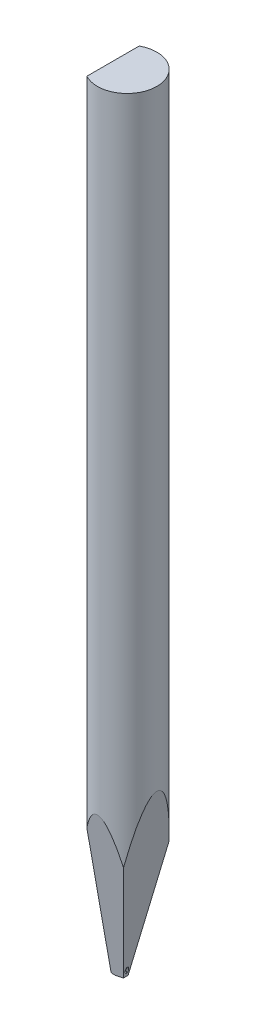
ISO-10303-21;
HEADER;
FILE_DESCRIPTION(('STEP AP214'),'2;1');
FILE_NAME('part.step','',(''),(''),'','','');
FILE_SCHEMA(('AUTOMOTIVE_DESIGN { 1 0 10303 214 1 1 1 1 }'));
ENDSEC;
DATA;
#1=APPLICATION_CONTEXT('core data for automotive mechanical design processes');
#2=APPLICATION_PROTOCOL_DEFINITION('international standard','automotive_design',2000,#1);
#3=PRODUCT_CONTEXT('',#1,'mechanical');
#4=PRODUCT('Part','Part','',(#3));
#5=PRODUCT_RELATED_PRODUCT_CATEGORY('part','',(#4));
#6=PRODUCT_DEFINITION_FORMATION('','',#4);
#7=PRODUCT_DEFINITION_CONTEXT('part definition',#1,'design');
#8=PRODUCT_DEFINITION('design','',#6,#7);
#9=PRODUCT_DEFINITION_SHAPE('','',#8);
#10=(LENGTH_UNIT() NAMED_UNIT(*) SI_UNIT(.MILLI.,.METRE.));
#11=(NAMED_UNIT(*) PLANE_ANGLE_UNIT() SI_UNIT($,.RADIAN.));
#12=(NAMED_UNIT(*) SI_UNIT($,.STERADIAN.) SOLID_ANGLE_UNIT());
#13=UNCERTAINTY_MEASURE_WITH_UNIT(LENGTH_MEASURE(1.E-05),#10,'distance_accuracy_value','');
#14=(GEOMETRIC_REPRESENTATION_CONTEXT(3) GLOBAL_UNCERTAINTY_ASSIGNED_CONTEXT((#13)) GLOBAL_UNIT_ASSIGNED_CONTEXT((#10,
#11,#12)) REPRESENTATION_CONTEXT('',''));
#15=CARTESIAN_POINT('',(0.,0.,0.));
#16=DIRECTION('',(0.,0.,1.));
#17=DIRECTION('',(1.,0.,0.));
#18=AXIS2_PLACEMENT_3D('',#15,#16,#17);
#19=CARTESIAN_POINT('',(26.8738719491216,0.,0.0508));
#20=DIRECTION('',(0.,-0.173648177666931,0.984807753012208));
#21=DIRECTION('',(0.,-0.984807753012208,-0.173648177666931));
#22=AXIS2_PLACEMENT_3D('',#19,#20,#21);
#23=PLANE('',#22);
#24=CARTESIAN_POINT('',(-0.35052,0.0254,0.0552787053099968));
#25=DIRECTION('',(0.,-0.173648177666931,0.984807753012208));
#26=DIRECTION('',(0.,-0.984807753012208,-0.173648177666931));
#27=AXIS2_PLACEMENT_3D('',#24,#25,#26);
#28=ELLIPSE('',#27,0.0257918359418979,0.0254);
#29=CARTESIAN_POINT('',(-0.35052,0.,0.0508000000000018));
#30=VERTEX_POINT('',#29);
#31=CARTESIAN_POINT('',(-0.37592,0.0254,0.0552787053099968));
#32=VERTEX_POINT('',#31);
#33=EDGE_CURVE('E168',#30,#32,#28,.F.);
#34=ORIENTED_EDGE('',*,*,#33,.F.);
#35=DIRECTION('',(-1.,0.,0.));
#36=VECTOR('',#35,1.);
#37=CARTESIAN_POINT('',(26.8738719491216,0.,0.0508));
#38=LINE('',#37,#36);
#39=CARTESIAN_POINT('',(-0.248920000000003,0.,0.0508));
#40=VERTEX_POINT('',#39);
#41=EDGE_CURVE('E156',#40,#30,#38,.T.);
#42=ORIENTED_EDGE('',*,*,#41,.F.);
#43=DIRECTION('',(-0.964921520309631,-0.258549942126377,-0.0455893306574928));
#44=VECTOR('',#43,1.);
#45=CARTESIAN_POINT('',(25.0043939244254,6.76660507225945,1.2439350420381));
#46=LINE('',#45,#44);
#47=CARTESIAN_POINT('',(-0.0356433899412251,0.0571472954296968,0.0608766100587731));
#48=VERTEX_POINT('',#47);
#49=EDGE_CURVE('E279',#48,#40,#46,.T.);
#50=ORIENTED_EDGE('',*,*,#49,.F.);
#51=DIRECTION('',(-0.171087869746036,-0.970287525247814,-0.171087869746036));
#52=VECTOR('',#51,1.);
#53=CARTESIAN_POINT('',(0.742244968889041,4.46877140255603,0.838764968889042));
#54=LINE('',#53,#52);
#55=CARTESIAN_POINT('',(0.510025990868478,3.15179213433781,0.606545990868478));
#56=VERTEX_POINT('',#55);
#57=EDGE_CURVE('E276',#56,#48,#54,.T.);
#58=ORIENTED_EDGE('',*,*,#57,.F.);
#59=CARTESIAN_POINT('',(0.,-0.288101116436578,0.));
#60=DIRECTION('',(0.,-0.173648177666931,0.984807753012208));
#61=DIRECTION('',(0.,-0.984807753012208,-0.173648177666931));
#62=AXIS2_PLACEMENT_3D('',#59,#60,#61);
#63=ELLIPSE('',#62,4.56371043248163,0.792479999999998);
#64=CARTESIAN_POINT('',(-0.37592,3.66844093071414,0.69764511322018));
#65=VERTEX_POINT('',#64);
#66=EDGE_CURVE('E155',#56,#65,#63,.T.);
#67=ORIENTED_EDGE('',*,*,#66,.T.);
#68=DIRECTION('',(0.,0.984807753012208,0.173648177666931));
#69=VECTOR('',#68,1.);
#70=CARTESIAN_POINT('',(-0.37592,20.2093857917021,3.6142599786234));
#71=LINE('',#70,#69);
#72=EDGE_CURVE('E297',#32,#65,#71,.T.);
#73=ORIENTED_EDGE('',*,*,#72,.F.);
#74=EDGE_LOOP('',(#34,#42,#50,#58,#67,#73));
#75=FACE_BOUND('',#74,.T.);
#76=ADVANCED_FACE('F43',(#75),#23,.T.);
#77=CARTESIAN_POINT('',(26.8738719491216,0.,-0.0508));
#78=DIRECTION('',(0.,-0.173648177666931,-0.984807753012208));
#79=DIRECTION('',(0.,0.984807753012208,-0.173648177666931));
#80=AXIS2_PLACEMENT_3D('',#77,#78,#79);
#81=PLANE('',#80);
#82=CARTESIAN_POINT('',(-0.35052,0.0254,-0.0552787053099968));
#83=DIRECTION('',(0.,-0.173648177666931,-0.984807753012208));
#84=DIRECTION('',(0.,0.984807753012208,-0.173648177666931));
#85=AXIS2_PLACEMENT_3D('',#82,#83,#84);
#86=ELLIPSE('',#85,0.0257918359418979,0.0254);
#87=CARTESIAN_POINT('',(-0.37592,0.0254,-0.0552787053099968));
#88=VERTEX_POINT('',#87);
#89=CARTESIAN_POINT('',(-0.35052,0.,-0.0508000000000002));
#90=VERTEX_POINT('',#89);
#91=EDGE_CURVE('E11',#88,#90,#86,.F.);
#92=ORIENTED_EDGE('',*,*,#91,.F.);
#93=DIRECTION('',(0.,-0.984807753012208,0.173648177666931));
#94=VECTOR('',#93,1.);
#95=CARTESIAN_POINT('',(-0.37592,20.5673030312895,-3.67737044482337));
#96=LINE('',#95,#94);
#97=CARTESIAN_POINT('',(-0.37592,3.66844093071414,-0.69764511322018));
#98=VERTEX_POINT('',#97);
#99=EDGE_CURVE('E299',#98,#88,#96,.T.);
#100=ORIENTED_EDGE('',*,*,#99,.F.);
#101=CARTESIAN_POINT('',(0.,-0.288101116436578,0.));
#102=DIRECTION('',(0.,-0.173648177666931,-0.984807753012208));
#103=DIRECTION('',(0.,-0.984807753012208,0.173648177666931));
#104=AXIS2_PLACEMENT_3D('',#101,#102,#103);
#105=ELLIPSE('',#104,4.56371043248163,0.792479999999998);
#106=CARTESIAN_POINT('',(0.510025990868478,3.15179213433781,-0.606545990868478));
#107=VERTEX_POINT('',#106);
#108=EDGE_CURVE('E285',#98,#107,#105,.T.);
#109=ORIENTED_EDGE('',*,*,#108,.T.);
#110=DIRECTION('',(0.171087869746036,0.970287525247814,-0.171087869746036));
#111=VECTOR('',#110,1.);
#112=CARTESIAN_POINT('',(0.742244968889041,4.46877140255603,-0.838764968889042));
#113=LINE('',#112,#111);
#114=CARTESIAN_POINT('',(-0.0356433899412251,0.0571472954296968,-0.0608766100587731));
#115=VERTEX_POINT('',#114);
#116=EDGE_CURVE('E301',#115,#107,#113,.T.);
#117=ORIENTED_EDGE('',*,*,#116,.F.);
#118=DIRECTION('',(0.964921520309631,0.258549942126377,-0.0455893306574928));
#119=VECTOR('',#118,1.);
#120=CARTESIAN_POINT('',(25.0043939244254,6.76660507225945,-1.2439350420381));
#121=LINE('',#120,#119);
#122=CARTESIAN_POINT('',(-0.248920000000003,0.,-0.0508));
#123=VERTEX_POINT('',#122);
#124=EDGE_CURVE('E152',#123,#115,#121,.T.);
#125=ORIENTED_EDGE('',*,*,#124,.F.);
#126=DIRECTION('',(-1.,0.,0.));
#127=VECTOR('',#126,1.);
#128=CARTESIAN_POINT('',(26.8738719491216,0.,-0.0508));
#129=LINE('',#128,#127);
#130=EDGE_CURVE('E147',#123,#90,#129,.T.);
#131=ORIENTED_EDGE('',*,*,#130,.T.);
#132=EDGE_LOOP('',(#92,#100,#109,#117,#125,#131));
#133=FACE_BOUND('',#132,.T.);
#134=ADVANCED_FACE('F149',(#133),#81,.T.);
#135=CARTESIAN_POINT('',(-0.24892,0.,27.2760283406468));
#136=DIRECTION('',(-0.258819045102522,0.965925826289068,0.));
#137=DIRECTION('',(-0.965925826289068,-0.258819045102522,0.));
#138=AXIS2_PLACEMENT_3D('',#135,#136,#137);
#139=PLANE('',#138);
#140=DIRECTION('',(-0.965925826289068,-0.258819045102522,0.));
#141=VECTOR('',#140,1.);
#142=CARTESIAN_POINT('',(-0.24892,0.,0.0253999999999983));
#143=LINE('',#142,#141);
#144=CARTESIAN_POINT('',(-0.1524,0.0258624560534521,0.0253999999999992));
#145=VERTEX_POINT('',#144);
#146=CARTESIAN_POINT('',(-0.239405220676076,0.00254947743600541,0.0254));
#147=VERTEX_POINT('',#146);
#148=EDGE_CURVE('E237',#145,#147,#143,.T.);
#149=ORIENTED_EDGE('',*,*,#148,.F.);
#150=DIRECTION('',(0.,0.,1.));
#151=VECTOR('',#150,1.);
#152=CARTESIAN_POINT('',(-0.1524,0.025862456053452,27.2760283406468));
#153=LINE('',#152,#151);
#154=CARTESIAN_POINT('',(-0.1524,0.0258624560534521,-0.0253999999999992));
#155=VERTEX_POINT('',#154);
#156=EDGE_CURVE('E51',#155,#145,#153,.T.);
#157=ORIENTED_EDGE('',*,*,#156,.F.);
#158=DIRECTION('',(-0.965925826289068,-0.258819045102522,0.));
#159=VECTOR('',#158,1.);
#160=CARTESIAN_POINT('',(-0.24892,0.,-0.0253999999999983));
#161=LINE('',#160,#159);
#162=CARTESIAN_POINT('',(-0.239405220676076,0.00254947743600541,-0.0254));
#163=VERTEX_POINT('',#162);
#164=EDGE_CURVE('E259',#155,#163,#161,.T.);
#165=ORIENTED_EDGE('',*,*,#164,.T.);
#166=CARTESIAN_POINT('',(-1.19212120059688,-0.25273,0.));
#167=DIRECTION('',(-0.258819045102522,0.965925826289068,0.));
#168=DIRECTION('',(-0.965925826289068,-0.258819045102522,0.));
#169=AXIS2_PLACEMENT_3D('',#166,#167,#168);
#170=ELLIPSE('',#169,0.991194445904787,0.25654);
#171=CARTESIAN_POINT('',(-0.24892,0.,-0.0440490487978937));
#172=VERTEX_POINT('',#171);
#173=EDGE_CURVE('E304',#163,#172,#170,.T.);
#174=ORIENTED_EDGE('',*,*,#173,.T.);
#175=DIRECTION('',(0.,0.,-1.));
#176=VECTOR('',#175,1.);
#177=CARTESIAN_POINT('',(-0.24892,0.,27.2760283406468));
#178=LINE('',#177,#176);
#179=EDGE_CURVE('E270',#172,#123,#178,.T.);
#180=ORIENTED_EDGE('',*,*,#179,.T.);
#181=ORIENTED_EDGE('',*,*,#124,.T.);
#182=DIRECTION('',(0.,0.,-1.));
#183=VECTOR('',#182,1.);
#184=CARTESIAN_POINT('',(-0.0356433899412272,0.0571472954296959,27.2760283406468));
#185=LINE('',#184,#183);
#186=EDGE_CURVE('E266',#48,#115,#185,.T.);
#187=ORIENTED_EDGE('',*,*,#186,.F.);
#188=ORIENTED_EDGE('',*,*,#49,.T.);
#189=CARTESIAN_POINT('',(-0.24892,0.,0.0440490487979025));
#190=VERTEX_POINT('',#189);
#191=EDGE_CURVE('E271',#40,#190,#178,.T.);
#192=ORIENTED_EDGE('',*,*,#191,.T.);
#193=EDGE_CURVE('E258',#190,#147,#170,.T.);
#194=ORIENTED_EDGE('',*,*,#193,.T.);
#195=EDGE_LOOP('',(#149,#157,#165,#174,#180,#181,#187,#188,#192,#194));
#196=FACE_BOUND('',#195,.T.);
#197=ADVANCED_FACE('F256',(#196),#139,.F.);
#198=CARTESIAN_POINT('',(26.7151219491216,-0.25273,0.));
#199=DIRECTION('',(-1.,0.,0.));
#200=DIRECTION('',(0.,0.,1.));
#201=AXIS2_PLACEMENT_3D('',#198,#199,#200);
#202=CYLINDRICAL_SURFACE('',#201,0.25654);
#203=DIRECTION('',(-1.,0.,0.));
#204=VECTOR('',#203,1.);
#205=CARTESIAN_POINT('',(26.7151219491216,0.,0.0440490487979025));
#206=LINE('',#205,#204);
#207=CARTESIAN_POINT('',(-0.35052,0.,0.0440490487979025));
#208=VERTEX_POINT('',#207);
#209=EDGE_CURVE('E236',#190,#208,#206,.T.);
#210=ORIENTED_EDGE('',*,*,#209,.T.);
#211=CARTESIAN_POINT('',(-0.35052,0.,0.0440490487979025));
#212=CARTESIAN_POINT('',(-0.35078848817644,-1.38726349909951E-07,0.0440497784747319));
#213=CARTESIAN_POINT('',(-0.351055982307204,4.25147931822013E-06,0.0440246591549447));
#214=CARTESIAN_POINT('',(-0.351579389054846,2.0805410210379E-05,0.0439295541543714));
#215=CARTESIAN_POINT('',(-0.351835403274202,3.28734548608375E-05,0.0438601206795768));
#216=CARTESIAN_POINT('',(-0.352401306187798,6.77563517455717E-05,0.0436586556898192));
#217=CARTESIAN_POINT('',(-0.352706739649212,9.26096324601249E-05,0.0435146861462917));
#218=CARTESIAN_POINT('',(-0.353291410090599,0.000149930422546129,0.0431803390571994));
#219=CARTESIAN_POINT('',(-0.35357049860326,0.000182437850382041,0.0429897179986155));
#220=CARTESIAN_POINT('',(-0.354284249916599,0.000276384384018258,0.0424342271797826));
#221=CARTESIAN_POINT('',(-0.354694684916317,0.000342399333102313,0.0420393802910815));
#222=CARTESIAN_POINT('',(-0.355454380027007,0.000480956757029056,0.0411967283297512));
#223=CARTESIAN_POINT('',(-0.355803500201084,0.000553513605914254,0.0407488059250617));
#224=CARTESIAN_POINT('',(-0.357023721721947,0.000829180281704987,0.0390145802574647));
#225=CARTESIAN_POINT('',(-0.357745252309328,0.00103963454762411,0.0376264785849838));
#226=CARTESIAN_POINT('',(-0.358995891147406,0.00144770049066084,0.0347654556325933));
#227=CARTESIAN_POINT('',(-0.359523783485258,0.00164522482527529,0.0332920634560851));
#228=CARTESIAN_POINT('',(-0.361429245971277,0.00240612579285876,0.0271956033575434));
#229=CARTESIAN_POINT('',(-0.362287270544024,0.00287488941054911,0.0224023391030087));
#230=CARTESIAN_POINT('',(-0.363463545050744,0.00354027553557429,0.0127388875432288));
#231=CARTESIAN_POINT('',(-0.36377945748539,0.00373571886407996,0.00786845805694975));
#232=CARTESIAN_POINT('',(-0.363974594516319,0.00385544758005879,-0.00240468668628697));
#233=CARTESIAN_POINT('',(-0.363803650185726,0.00374858915079331,-0.00780876994683235));
#234=CARTESIAN_POINT('',(-0.362872887097424,0.00319477377607287,-0.0185329895524554));
#235=CARTESIAN_POINT('',(-0.362117644355291,0.00275046015129755,-0.023853451903929));
#236=CARTESIAN_POINT('',(-0.360290831846411,0.00195011054272339,-0.0308963303995329));
#237=CARTESIAN_POINT('',(-0.35972152166498,0.00171600547424954,-0.0327659202347357));
#238=CARTESIAN_POINT('',(-0.358250803200164,0.00118861511827664,-0.0366350918329842));
#239=CARTESIAN_POINT('',(-0.357319404770106,0.000891640370373057,-0.038625869822246));
#240=CARTESIAN_POINT('',(-0.355811910807391,0.000556342228631212,-0.0407299910208257));
#241=CARTESIAN_POINT('',(-0.355556019481239,0.00050276117047605,-0.041061511399909));
#242=CARTESIAN_POINT('',(-0.355011086774868,0.000398598927317723,-0.0416987410250987));
#243=CARTESIAN_POINT('',(-0.354721951899049,0.000348026841613581,-0.0420043730576781));
#244=CARTESIAN_POINT('',(-0.354100848358876,0.000251693745505205,-0.0425807654259375));
#245=CARTESIAN_POINT('',(-0.353768294273941,0.000206017761949227,-0.0428509236076793));
#246=CARTESIAN_POINT('',(-0.353060936131458,0.000124934026163114,-0.043326796844501));
#247=CARTESIAN_POINT('',(-0.352686520549016,8.94412406542051E-05,-0.0435330467897076));
#248=CARTESIAN_POINT('',(-0.352013912384543,4.24631960922777E-05,-0.043804882069718));
#249=CARTESIAN_POINT('',(-0.35172574987773,2.6985919990288E-05,-0.0438940056331177));
#250=CARTESIAN_POINT('',(-0.351132468015558,5.56177750996394E-06,-0.0440171458009437));
#251=CARTESIAN_POINT('',(-0.350827138904454,-2.11703862739877E-07,-0.0440501599700827));
#252=CARTESIAN_POINT('',(-0.350520000107277,-2.84172643272283E-11,-0.0440490490581011));
#253=B_SPLINE_CURVE_WITH_KNOTS('',3,(#211,#212,#213,#214,#215,#216,#217,#218,#219,#220,#221,
#222,#223,#224,#225,#226,#227,#228,#229,#230,#231,#232,#233,#234,#235,#236,#237,#238,#239,#240,
#241,#242,#243,#244,#245,#246,#247,#248,#249,#250,#251,#252),.UNSPECIFIED.,.F.,.F.,(4,2,2,2,2,2,
2,2,2,2,2,2,2,2,2,2,2,2,2,2,4),(0.,0.000802651030469693,0.00159549034689844,0.00260553382891654,
0.00362096643362997,0.00533125727333843,0.00704540211741003,0.0117441905397929,
0.0164719984733795,0.0310441794571721,0.0456790368921277,0.061874786376229,0.0779449648249616,
0.0838502099790526,0.0904150136471092,0.0916799548752425,0.0929485449610161,0.094236460433138,
0.0955132856132421,0.0964140451535049,0.0973307345412178),.UNSPECIFIED.);
#254=CARTESIAN_POINT('',(-0.35052,0.,-0.0440490487979024));
#255=VERTEX_POINT('',#254);
#256=EDGE_CURVE('E65',#208,#255,#253,.T.);
#257=ORIENTED_EDGE('',*,*,#256,.T.);
#258=DIRECTION('',(-1.,0.,0.));
#259=VECTOR('',#258,1.);
#260=CARTESIAN_POINT('',(26.7151219491216,0.,-0.0440490487979024));
#261=LINE('',#260,#259);
#262=EDGE_CURVE('E161',#172,#255,#261,.T.);
#263=ORIENTED_EDGE('',*,*,#262,.F.);
#264=ORIENTED_EDGE('',*,*,#173,.F.);
#265=DIRECTION('',(-1.,0.,0.));
#266=VECTOR('',#265,1.);
#267=CARTESIAN_POINT('',(26.7151219491216,0.00254947743600541,-0.0254));
#268=LINE('',#267,#266);
#269=CARTESIAN_POINT('',(-0.253185714241458,0.00254947743600559,-0.0254));
#270=VERTEX_POINT('',#269);
#271=EDGE_CURVE('E231',#163,#270,#268,.T.);
#272=ORIENTED_EDGE('',*,*,#271,.T.);
#273=CARTESIAN_POINT('',(-0.253185714241458,0.00254947743600573,-0.0254));
#274=CARTESIAN_POINT('',(-0.255344152437488,0.00254821976197901,-0.0254013009354084));
#275=CARTESIAN_POINT('',(-0.257508896148558,0.00256911110195352,-0.0252020255821013));
#276=CARTESIAN_POINT('',(-0.261773895152618,0.00264859800939065,-0.0243899841626428));
#277=CARTESIAN_POINT('',(-0.263873578972645,0.0027074619818362,-0.0237742730573775));
#278=CARTESIAN_POINT('',(-0.267626031616496,0.00284608136414771,-0.0222286703517022));
#279=CARTESIAN_POINT('',(-0.269300856497538,0.00292194034965624,-0.021352457347443));
#280=CARTESIAN_POINT('',(-0.27244079207468,0.00308585904243782,-0.0192895972163655));
#281=CARTESIAN_POINT('',(-0.27390665388976,0.00317387269108634,-0.0181041076476676));
#282=CARTESIAN_POINT('',(-0.276366039583271,0.00333559836240606,-0.015635850439184));
#283=CARTESIAN_POINT('',(-0.277397031932462,0.00340957502841642,-0.0143904532472022));
#284=CARTESIAN_POINT('',(-0.279197642724447,0.00354554699833843,-0.011721404920778));
#285=CARTESIAN_POINT('',(-0.279967378304327,0.0036075476664213,-0.0102978340652005));
#286=CARTESIAN_POINT('',(-0.28111933145939,0.00370301261680098,-0.00752005069165784));
#287=CARTESIAN_POINT('',(-0.281539304675408,0.00373916440166441,-0.00618151235947799));
#288=CARTESIAN_POINT('',(-0.28212899011042,0.00379042106023015,-0.00345028994684206));
#289=CARTESIAN_POINT('',(-0.282298871740865,0.00380554018102709,-0.00205764317627049));
#290=CARTESIAN_POINT('',(-0.282377204315338,0.00381248465314673,0.000630345559243691));
#291=CARTESIAN_POINT('',(-0.282304248308792,0.00380596676409844,0.00192517940256175));
#292=CARTESIAN_POINT('',(-0.281940547166958,0.00377400793094485,0.00448346828200016));
#293=CARTESIAN_POINT('',(-0.281649827597694,0.00374856920819842,0.00574692698365739));
#294=CARTESIAN_POINT('',(-0.280866352887883,0.00368193519333236,0.00819642161052897));
#295=CARTESIAN_POINT('',(-0.280375403684943,0.00364088096011275,0.00938304248119851));
#296=CARTESIAN_POINT('',(-0.279210676282721,0.00354733009237121,0.0116621019945775));
#297=CARTESIAN_POINT('',(-0.278536868559208,0.00349483161033698,0.012754525390651));
#298=CARTESIAN_POINT('',(-0.2769926905587,0.00338075821868183,0.0148739491572209));
#299=CARTESIAN_POINT('',(-0.276114232949906,0.00331886240703964,0.0158950230304153));
#300=CARTESIAN_POINT('',(-0.274212018839988,0.00319414215410004,0.0177907158387305));
#301=CARTESIAN_POINT('',(-0.273188226754044,0.00313131748875984,0.018665298791213));
#302=CARTESIAN_POINT('',(-0.27092092345585,0.00300434474975359,0.0203343304106705));
#303=CARTESIAN_POINT('',(-0.269665746061856,0.00294065259710882,0.0211129342659846));
#304=CARTESIAN_POINT('',(-0.267053167403426,0.00282443356201876,0.022476028589432));
#305=CARTESIAN_POINT('',(-0.265695676298075,0.00277191665086016,0.0230603459616653));
#306=CARTESIAN_POINT('',(-0.262735482423285,0.00267645490553324,0.0240960594974842));
#307=CARTESIAN_POINT('',(-0.261123536851079,0.00263557371422842,0.0245211386231685));
#308=CARTESIAN_POINT('',(-0.257856385750328,0.00257659596792793,0.0251278443352573));
#309=CARTESIAN_POINT('',(-0.256201240797023,0.00255846909197462,0.025309794920245));
#310=CARTESIAN_POINT('',(-0.25409070503502,0.00255033559948842,0.0253913129937453));
#311=CARTESIAN_POINT('',(-0.253638123359283,0.00254946578651781,0.0254000103445672));
#312=CARTESIAN_POINT('',(-0.253185714241458,0.00254947743600542,0.0254));
#313=B_SPLINE_CURVE_WITH_KNOTS('',3,(#273,#274,#275,#276,#277,#278,#279,#280,#281,#282,#283,
#284,#285,#286,#287,#288,#289,#290,#291,#292,#293,#294,#295,#296,#297,#298,#299,#300,#301,#302,
#303,#304,#305,#306,#307,#308,#309,#310,#311,#312),.UNSPECIFIED.,.F.,.F.,(4,2,2,2,2,2,2,2,2,2,2,
2,2,2,2,2,2,2,2,4),(0.,0.00647645074134469,0.0129991886745043,0.0186407746721444,
0.0242615409814003,0.0290886660543625,0.0339136239696083,0.0381012910365914,0.0422861200803957,
0.0461581273050805,0.0500296800170115,0.0538670600667932,0.05770506006675,0.0617332918679123,
0.0657625116792609,0.070180025200047,0.074601463941463,0.0795846075254044,0.0845611038148627,
0.0859187049539023),.UNSPECIFIED.);
#314=CARTESIAN_POINT('',(-0.253185714241458,0.00254947743600582,0.0254));
#315=VERTEX_POINT('',#314);
#316=EDGE_CURVE('E222',#270,#315,#313,.T.);
#317=ORIENTED_EDGE('',*,*,#316,.T.);
#318=DIRECTION('',(-1.,0.,0.));
#319=VECTOR('',#318,1.);
#320=CARTESIAN_POINT('',(26.7151219491216,0.00254947743600541,0.0254));
#321=LINE('',#320,#319);
#322=EDGE_CURVE('E230',#147,#315,#321,.T.);
#323=ORIENTED_EDGE('',*,*,#322,.F.);
#324=ORIENTED_EDGE('',*,*,#193,.F.);
#325=EDGE_LOOP('',(#210,#257,#263,#264,#272,#317,#323,#324));
#326=FACE_BOUND('',#325,.T.);
#327=ADVANCED_FACE('F183',(#326),#202,.F.);
#328=CARTESIAN_POINT('',(0.,0.,0.));
#329=DIRECTION('',(0.,1.,0.));
#330=DIRECTION('',(0.,0.,1.));
#331=AXIS2_PLACEMENT_3D('',#328,#329,#330);
#332=PLANE('',#331);
#333=ORIENTED_EDGE('',*,*,#41,.T.);
#334=DIRECTION('',(0.,0.,-1.));
#335=VECTOR('',#334,1.);
#336=CARTESIAN_POINT('',(-0.35052,0.,26.4357219491216));
#337=LINE('',#336,#335);
#338=EDGE_CURVE('E58',#30,#208,#337,.T.);
#339=ORIENTED_EDGE('',*,*,#338,.T.);
#340=ORIENTED_EDGE('',*,*,#209,.F.);
#341=ORIENTED_EDGE('',*,*,#191,.F.);
#342=EDGE_LOOP('',(#333,#339,#340,#341));
#343=FACE_BOUND('',#342,.T.);
#344=ADVANCED_FACE('F308',(#343),#332,.F.);
#345=ORIENTED_EDGE('',*,*,#262,.T.);
#346=EDGE_CURVE('E159',#255,#90,#337,.T.);
#347=ORIENTED_EDGE('',*,*,#346,.T.);
#348=ORIENTED_EDGE('',*,*,#130,.F.);
#349=ORIENTED_EDGE('',*,*,#179,.F.);
#350=EDGE_LOOP('',(#345,#347,#348,#349));
#351=FACE_BOUND('',#350,.T.);
#352=ADVANCED_FACE('F160',(#351),#332,.F.);
#353=CARTESIAN_POINT('',(0.,21.0312,0.));
#354=DIRECTION('',(0.,-1.,0.));
#355=DIRECTION('',(0.,0.,-1.));
#356=AXIS2_PLACEMENT_3D('',#353,#354,#355);
#357=CYLINDRICAL_SURFACE('',#356,0.792479999999998);
#358=ORIENTED_EDGE('',*,*,#66,.F.);
#359=CARTESIAN_POINT('',(0.,0.259291004792921,0.));
#360=DIRECTION('',(-0.984807753012208,0.173648177666931,0.));
#361=DIRECTION('',(-0.173648177666931,-0.984807753012208,0.));
#362=AXIS2_PLACEMENT_3D('',#359,#360,#361);
#363=ELLIPSE('',#362,4.56371043248165,0.792479999999998);
#364=EDGE_CURVE('E273',#56,#107,#363,.T.);
#365=ORIENTED_EDGE('',*,*,#364,.T.);
#366=ORIENTED_EDGE('',*,*,#108,.F.);
#367=DIRECTION('',(0.,-1.,0.));
#368=VECTOR('',#367,1.);
#369=CARTESIAN_POINT('',(-0.37592,21.0312,-0.69764511322018));
#370=LINE('',#369,#368);
#371=CARTESIAN_POINT('',(-0.37592,21.0312,-0.69764511322018));
#372=VERTEX_POINT('',#371);
#373=EDGE_CURVE('E291',#372,#98,#370,.T.);
#374=ORIENTED_EDGE('',*,*,#373,.F.);
#375=CARTESIAN_POINT('',(0.,21.0312,0.));
#376=DIRECTION('',(0.,1.,0.));
#377=DIRECTION('',(0.,0.,1.));
#378=AXIS2_PLACEMENT_3D('',#375,#376,#377);
#379=CIRCLE('',#378,0.792479999999998);
#380=CARTESIAN_POINT('',(-0.37592,21.0312,0.69764511322018));
#381=VERTEX_POINT('',#380);
#382=EDGE_CURVE('E294',#381,#372,#379,.T.);
#383=ORIENTED_EDGE('',*,*,#382,.F.);
#384=DIRECTION('',(0.,-1.,0.));
#385=VECTOR('',#384,1.);
#386=CARTESIAN_POINT('',(-0.37592,21.0312,0.69764511322018));
#387=LINE('',#386,#385);
#388=EDGE_CURVE('E289',#65,#381,#387,.F.);
#389=ORIENTED_EDGE('',*,*,#388,.F.);
#390=EDGE_LOOP('',(#358,#365,#366,#374,#383,#389));
#391=FACE_BOUND('',#390,.T.);
#392=ADVANCED_FACE('F45',(#391),#357,.T.);
#393=CARTESIAN_POINT('',(-0.37592,21.0312,-1.04648));
#394=DIRECTION('',(-1.,0.,0.));
#395=DIRECTION('',(0.,0.,1.));
#396=AXIS2_PLACEMENT_3D('',#393,#394,#395);
#397=PLANE('',#396);
#398=DIRECTION('',(0.,0.,-1.));
#399=VECTOR('',#398,1.);
#400=CARTESIAN_POINT('',(-0.37592,0.0254,26.4357219491216));
#401=LINE('',#400,#399);
#402=EDGE_CURVE('E163',#32,#88,#401,.T.);
#403=ORIENTED_EDGE('',*,*,#402,.F.);
#404=ORIENTED_EDGE('',*,*,#72,.T.);
#405=ORIENTED_EDGE('',*,*,#388,.T.);
#406=DIRECTION('',(0.,0.,-1.));
#407=VECTOR('',#406,1.);
#408=CARTESIAN_POINT('',(-0.37592,21.0312,-1.04648));
#409=LINE('',#408,#407);
#410=EDGE_CURVE('E287',#381,#372,#409,.T.);
#411=ORIENTED_EDGE('',*,*,#410,.T.);
#412=ORIENTED_EDGE('',*,*,#373,.T.);
#413=ORIENTED_EDGE('',*,*,#99,.T.);
#414=EDGE_LOOP('',(#403,#404,#405,#411,#412,#413));
#415=FACE_BOUND('',#414,.T.);
#416=ADVANCED_FACE('F322',(#415),#397,.T.);
#417=CARTESIAN_POINT('',(0.,21.0312,0.));
#418=DIRECTION('',(0.,1.,0.));
#419=DIRECTION('',(0.,0.,1.));
#420=AXIS2_PLACEMENT_3D('',#417,#418,#419);
#421=PLANE('',#420);
#422=ORIENTED_EDGE('',*,*,#382,.T.);
#423=ORIENTED_EDGE('',*,*,#410,.F.);
#424=EDGE_LOOP('',(#422,#423));
#425=FACE_BOUND('',#424,.T.);
#426=ADVANCED_FACE('F325',(#425),#421,.T.);
#427=CARTESIAN_POINT('',(-0.0356433899412272,0.0571472954296959,27.2760283406468));
#428=DIRECTION('',(-0.984807753012208,0.173648177666931,0.));
#429=DIRECTION('',(-0.173648177666931,-0.984807753012208,0.));
#430=AXIS2_PLACEMENT_3D('',#427,#428,#429);
#431=PLANE('',#430);
#432=CARTESIAN_POINT('',(-0.0068321519080053,0.220543945888185,0.));
#433=DIRECTION('',(-0.984807753012208,0.173648177666931,0.));
#434=DIRECTION('',(0.173648177666931,0.984807753012208,0.));
#435=AXIS2_PLACEMENT_3D('',#432,#433,#434);
#436=ELLIPSE('',#435,0.0783705194739164,0.0465617325680185);
#437=CARTESIAN_POINT('',(0.00677674598145098,0.297723841073692,0.));
#438=VERTEX_POINT('',#437);
#439=EDGE_CURVE('E234',#438,#438,#436,.F.);
#440=ORIENTED_EDGE('',*,*,#439,.F.);
#441=EDGE_LOOP('',(#440));
#442=FACE_BOUND('',#441,.T.);
#443=ORIENTED_EDGE('',*,*,#364,.F.);
#444=ORIENTED_EDGE('',*,*,#57,.T.);
#445=ORIENTED_EDGE('',*,*,#186,.T.);
#446=ORIENTED_EDGE('',*,*,#116,.T.);
#447=EDGE_LOOP('',(#443,#444,#445,#446));
#448=FACE_BOUND('',#447,.T.);
#449=ADVANCED_FACE('F211',(#442,#448),#431,.F.);
#450=CARTESIAN_POINT('',(-0.1524,0.0762000000000001,0.0254));
#451=DIRECTION('',(-1.,0.,0.));
#452=DIRECTION('',(0.,0.,1.));
#453=AXIS2_PLACEMENT_3D('',#450,#451,#452);
#454=PLANE('',#453);
#455=ORIENTED_EDGE('',*,*,#156,.T.);
#456=DIRECTION('',(0.,1.,0.));
#457=VECTOR('',#456,1.);
#458=CARTESIAN_POINT('',(-0.1524,0.0762000000000001,0.0254));
#459=LINE('',#458,#457);
#460=CARTESIAN_POINT('',(-0.1524,0.0762000000000001,0.0254));
#461=VERTEX_POINT('',#460);
#462=EDGE_CURVE('E242',#145,#461,#459,.T.);
#463=ORIENTED_EDGE('',*,*,#462,.T.);
#464=CARTESIAN_POINT('',(-0.1524,0.0762,0.));
#465=DIRECTION('',(1.,0.,0.));
#466=DIRECTION('',(0.,1.,0.));
#467=AXIS2_PLACEMENT_3D('',#464,#465,#466);
#468=ELLIPSE('',#467,0.0322330626628433,0.0253999999999999);
#469=CARTESIAN_POINT('',(-0.1524,0.0762000000000001,-0.0253999999999914));
#470=VERTEX_POINT('',#469);
#471=EDGE_CURVE('E510',#470,#461,#468,.F.);
#472=ORIENTED_EDGE('',*,*,#471,.F.);
#473=DIRECTION('',(0.,1.,0.));
#474=VECTOR('',#473,1.);
#475=CARTESIAN_POINT('',(-0.1524,0.0762000000000001,-0.0254));
#476=LINE('',#475,#474);
#477=EDGE_CURVE('E244',#155,#470,#476,.T.);
#478=ORIENTED_EDGE('',*,*,#477,.F.);
#479=EDGE_LOOP('',(#455,#463,#472,#478));
#480=FACE_BOUND('',#479,.T.);
#481=ADVANCED_FACE('F195',(#480),#454,.T.);
#482=CARTESIAN_POINT('',(-0.0434217153241829,0.161343167418572,0.));
#483=DIRECTION('',(0.788010753606725,0.615661475325654,0.));
#484=DIRECTION('',(-0.615661475325654,0.788010753606725,0.));
#485=AXIS2_PLACEMENT_3D('',#482,#483,#484);
#486=CONICAL_SURFACE('',#485,0.0253999999999999,0.392699081698725);
#487=CARTESIAN_POINT('',(-0.0434217153241829,0.161343167418572,0.));
#488=DIRECTION('',(0.788010753606725,0.615661475325654,0.));
#489=DIRECTION('',(-0.615661475325654,0.788010753606725,0.));
#490=AXIS2_PLACEMENT_3D('',#487,#488,#489);
#491=CIRCLE('',#490,0.0253999999999999);
#492=CARTESIAN_POINT('',(-0.0590595167974545,0.181358640560183,0.));
#493=VERTEX_POINT('',#492);
#494=EDGE_CURVE('E181',#493,#493,#491,.T.);
#495=ORIENTED_EDGE('',*,*,#494,.F.);
#496=EDGE_LOOP('',(#495));
#497=FACE_BOUND('',#496,.T.);
#498=ORIENTED_EDGE('',*,*,#439,.T.);
#499=EDGE_LOOP('',(#498));
#500=FACE_BOUND('',#499,.T.);
#501=ADVANCED_FACE('F191',(#497,#500),#486,.F.);
#502=CARTESIAN_POINT('',(-0.207163759939111,0.0762000000000001,0.));
#503=DIRECTION('',(-0.529919264233209,-0.848048096156424,0.));
#504=DIRECTION('',(0.848048096156424,-0.529919264233209,0.));
#505=AXIS2_PLACEMENT_3D('',#502,#503,#504);
#506=CYLINDRICAL_SURFACE('',#505,0.0254);
#507=DIRECTION('',(0.529919264233209,0.848048096156424,0.));
#508=VECTOR('',#507,1.);
#509=CARTESIAN_POINT('',(-0.207163759939111,0.0762000000000001,-0.0254));
#510=LINE('',#509,#508);
#511=CARTESIAN_POINT('',(-0.207163759939112,0.0762000000000001,-0.0254));
#512=VERTEX_POINT('',#511);
#513=EDGE_CURVE('E503',#270,#512,#510,.T.);
#514=ORIENTED_EDGE('',*,*,#513,.T.);
#515=CARTESIAN_POINT('',(-0.207163759939111,0.0762000000000001,0.));
#516=DIRECTION('',(0.,-1.,0.));
#517=DIRECTION('',(-1.,0.,0.));
#518=AXIS2_PLACEMENT_3D('',#515,#516,#517);
#519=ELLIPSE('',#518,0.0299511314453973,0.0254);
#520=CARTESIAN_POINT('',(-0.207163759939111,0.0762000000000001,0.0254));
#521=VERTEX_POINT('',#520);
#522=EDGE_CURVE('E261',#512,#521,#519,.F.);
#523=ORIENTED_EDGE('',*,*,#522,.T.);
#524=DIRECTION('',(-0.529919264233209,-0.848048096156424,0.));
#525=VECTOR('',#524,1.);
#526=CARTESIAN_POINT('',(-0.183233240642376,0.114496836328449,0.0254));
#527=LINE('',#526,#525);
#528=EDGE_CURVE('E253',#521,#315,#527,.T.);
#529=ORIENTED_EDGE('',*,*,#528,.T.);
#530=ORIENTED_EDGE('',*,*,#316,.F.);
#531=EDGE_LOOP('',(#514,#523,#529,#530));
#532=FACE_BOUND('',#531,.T.);
#533=ADVANCED_FACE('F194',(#532),#506,.F.);
#534=CARTESIAN_POINT('',(0.,0.,0.0254));
#535=DIRECTION('',(0.,0.,-1.));
#536=DIRECTION('',(-1.,0.,0.));
#537=AXIS2_PLACEMENT_3D('',#534,#535,#536);
#538=PLANE('',#537);
#539=ORIENTED_EDGE('',*,*,#148,.T.);
#540=ORIENTED_EDGE('',*,*,#322,.T.);
#541=ORIENTED_EDGE('',*,*,#528,.F.);
#542=DIRECTION('',(-1.,0.,0.));
#543=VECTOR('',#542,1.);
#544=CARTESIAN_POINT('',(-0.237114891384509,0.0762000000000001,0.0254));
#545=LINE('',#544,#543);
#546=EDGE_CURVE('E252',#461,#521,#545,.T.);
#547=ORIENTED_EDGE('',*,*,#546,.F.);
#548=ORIENTED_EDGE('',*,*,#462,.F.);
#549=EDGE_LOOP('',(#539,#540,#541,#547,#548));
#550=FACE_BOUND('',#549,.T.);
#551=ADVANCED_FACE('F201',(#550),#538,.T.);
#552=CARTESIAN_POINT('',(0.,0.,-0.0254));
#553=DIRECTION('',(0.,0.,-1.));
#554=DIRECTION('',(-1.,0.,0.));
#555=AXIS2_PLACEMENT_3D('',#552,#553,#554);
#556=PLANE('',#555);
#557=ORIENTED_EDGE('',*,*,#477,.T.);
#558=DIRECTION('',(-1.,0.,0.));
#559=VECTOR('',#558,1.);
#560=CARTESIAN_POINT('',(-0.237114891384509,0.0762000000000001,-0.0254));
#561=LINE('',#560,#559);
#562=EDGE_CURVE('E508',#470,#512,#561,.T.);
#563=ORIENTED_EDGE('',*,*,#562,.T.);
#564=ORIENTED_EDGE('',*,*,#513,.F.);
#565=ORIENTED_EDGE('',*,*,#271,.F.);
#566=ORIENTED_EDGE('',*,*,#164,.F.);
#567=EDGE_LOOP('',(#557,#563,#564,#565,#566));
#568=FACE_BOUND('',#567,.T.);
#569=ADVANCED_FACE('F204',(#568),#556,.F.);
#570=CARTESIAN_POINT('',(-0.237114891384509,0.0762000000000001,0.0254));
#571=DIRECTION('',(0.,-1.,0.));
#572=DIRECTION('',(0.,0.,-1.));
#573=AXIS2_PLACEMENT_3D('',#570,#571,#572);
#574=PLANE('',#573);
#575=ORIENTED_EDGE('',*,*,#562,.F.);
#576=CARTESIAN_POINT('',(-0.1524,0.0762000000000001,0.));
#577=DIRECTION('',(0.,1.,0.));
#578=DIRECTION('',(1.,0.,0.));
#579=AXIS2_PLACEMENT_3D('',#576,#577,#578);
#580=ELLIPSE('',#579,0.0412564388352619,0.0253999999999999);
#581=EDGE_CURVE('E514',#461,#470,#580,.F.);
#582=ORIENTED_EDGE('',*,*,#581,.F.);
#583=ORIENTED_EDGE('',*,*,#546,.T.);
#584=ORIENTED_EDGE('',*,*,#522,.F.);
#585=EDGE_LOOP('',(#575,#582,#583,#584));
#586=FACE_BOUND('',#585,.T.);
#587=ADVANCED_FACE('F199',(#586),#574,.T.);
#588=CARTESIAN_POINT('',(-0.324214520655747,-0.0580362154134752,0.));
#589=DIRECTION('',(0.788010753606725,0.615661475325654,0.));
#590=DIRECTION('',(-0.615661475325654,0.788010753606725,0.));
#591=AXIS2_PLACEMENT_3D('',#588,#589,#590);
#592=CYLINDRICAL_SURFACE('',#591,0.0253999999999999);
#593=ORIENTED_EDGE('',*,*,#471,.T.);
#594=ORIENTED_EDGE('',*,*,#581,.T.);
#595=EDGE_LOOP('',(#593,#594));
#596=FACE_BOUND('',#595,.T.);
#597=ORIENTED_EDGE('',*,*,#494,.T.);
#598=EDGE_LOOP('',(#597));
#599=FACE_BOUND('',#598,.T.);
#600=ADVANCED_FACE('F190',(#596,#599),#592,.F.);
#601=CARTESIAN_POINT('',(-0.35052,0.0254,26.4357219491216));
#602=DIRECTION('',(0.,0.,-1.));
#603=DIRECTION('',(-1.,0.,0.));
#604=AXIS2_PLACEMENT_3D('',#601,#602,#603);
#605=CYLINDRICAL_SURFACE('',#604,0.0254);
#606=ORIENTED_EDGE('',*,*,#256,.F.);
#607=ORIENTED_EDGE('',*,*,#338,.F.);
#608=ORIENTED_EDGE('',*,*,#33,.T.);
#609=ORIENTED_EDGE('',*,*,#402,.T.);
#610=ORIENTED_EDGE('',*,*,#91,.T.);
#611=ORIENTED_EDGE('',*,*,#346,.F.);
#612=EDGE_LOOP('',(#606,#607,#608,#609,#610,#611));
#613=FACE_BOUND('',#612,.T.);
#614=ADVANCED_FACE('F166',(#613),#605,.T.);
#615=CLOSED_SHELL('',(#76,#134,#197,#327,#344,#352,#392,#416,#426,#449,#481,#501,#533,#551,#569,
#587,#600,#614));
#616=MANIFOLD_SOLID_BREP('B2',#615);
#617=ADVANCED_BREP_SHAPE_REPRESENTATION('',(#18,#616),#14);
#618=SHAPE_DEFINITION_REPRESENTATION(#9,#617);
ENDSEC;
END-ISO-10303-21;
